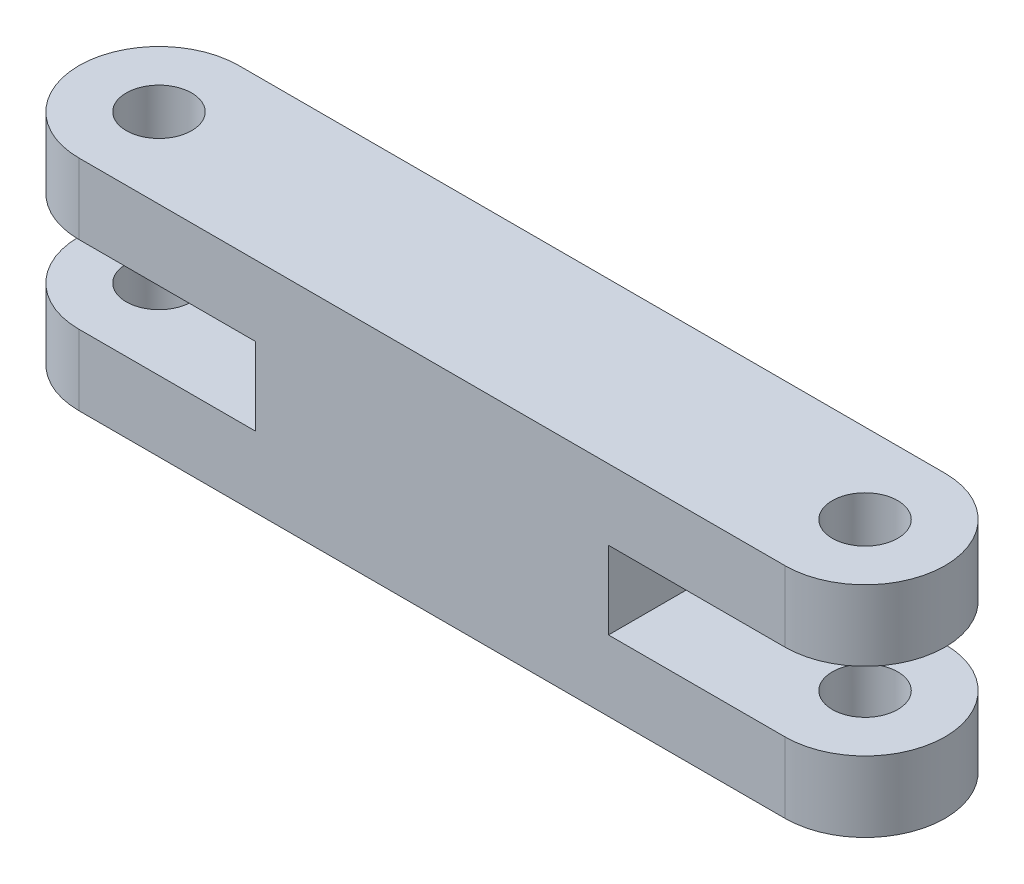
ISO-10303-21;
HEADER;
FILE_DESCRIPTION(('STEP AP214'),'2;1');
FILE_NAME('part.step','',(''),(''),'','','');
FILE_SCHEMA(('AUTOMOTIVE_DESIGN { 1 0 10303 214 1 1 1 1 }'));
ENDSEC;
DATA;
#1=APPLICATION_CONTEXT('core data for automotive mechanical design processes');
#2=APPLICATION_PROTOCOL_DEFINITION('international standard','automotive_design',2000,#1);
#3=PRODUCT_CONTEXT('',#1,'mechanical');
#4=PRODUCT('Part','Part','',(#3));
#5=PRODUCT_RELATED_PRODUCT_CATEGORY('part','',(#4));
#6=PRODUCT_DEFINITION_FORMATION('','',#4);
#7=PRODUCT_DEFINITION_CONTEXT('part definition',#1,'design');
#8=PRODUCT_DEFINITION('design','',#6,#7);
#9=PRODUCT_DEFINITION_SHAPE('','',#8);
#10=(LENGTH_UNIT() NAMED_UNIT(*) SI_UNIT(.MILLI.,.METRE.));
#11=(NAMED_UNIT(*) PLANE_ANGLE_UNIT() SI_UNIT($,.RADIAN.));
#12=(NAMED_UNIT(*) SI_UNIT($,.STERADIAN.) SOLID_ANGLE_UNIT());
#13=UNCERTAINTY_MEASURE_WITH_UNIT(LENGTH_MEASURE(1.E-05),#10,'distance_accuracy_value','');
#14=(GEOMETRIC_REPRESENTATION_CONTEXT(3) GLOBAL_UNCERTAINTY_ASSIGNED_CONTEXT((#13)) GLOBAL_UNIT_ASSIGNED_CONTEXT((#10,
#11,#12)) REPRESENTATION_CONTEXT('',''));
#15=CARTESIAN_POINT('',(0.,0.,0.));
#16=DIRECTION('',(0.,0.,1.));
#17=DIRECTION('',(1.,0.,0.));
#18=AXIS2_PLACEMENT_3D('',#15,#16,#17);
#19=CARTESIAN_POINT('',(0.,0.,-3.4));
#20=DIRECTION('',(0.,0.,-1.));
#21=DIRECTION('',(-1.,0.,0.));
#22=AXIS2_PLACEMENT_3D('',#19,#20,#21);
#23=PLANE('',#22);
#24=DIRECTION('',(-1.,0.,0.));
#25=VECTOR('',#24,1.);
#26=CARTESIAN_POINT('',(33.3999991416931,-3.,-3.4));
#27=LINE('',#26,#25);
#28=CARTESIAN_POINT('',(33.3999991416931,-3.,-3.4));
#29=VERTEX_POINT('',#28);
#30=CARTESIAN_POINT('',(25.8999991416931,-3.,-3.4));
#31=VERTEX_POINT('',#30);
#32=EDGE_CURVE('E149',#29,#31,#27,.T.);
#33=ORIENTED_EDGE('',*,*,#32,.T.);
#34=DIRECTION('',(0.,-1.,0.));
#35=VECTOR('',#34,1.);
#36=CARTESIAN_POINT('',(25.8999991416931,-3.,-3.4));
#37=LINE('',#36,#35);
#38=CARTESIAN_POINT('',(25.8999991416931,-6.30000003427267,-3.4));
#39=VERTEX_POINT('',#38);
#40=EDGE_CURVE('E178',#31,#39,#37,.T.);
#41=ORIENTED_EDGE('',*,*,#40,.T.);
#42=DIRECTION('',(-1.,0.,0.));
#43=VECTOR('',#42,1.);
#44=CARTESIAN_POINT('',(33.3999991416931,-6.30000003427267,-3.4));
#45=LINE('',#44,#43);
#46=CARTESIAN_POINT('',(33.3999991416931,-6.30000003427267,-3.4));
#47=VERTEX_POINT('',#46);
#48=EDGE_CURVE('E181',#47,#39,#45,.T.);
#49=ORIENTED_EDGE('',*,*,#48,.F.);
#50=DIRECTION('',(0.,1.,0.));
#51=VECTOR('',#50,1.);
#52=CARTESIAN_POINT('',(33.3999991416931,0.,-3.4));
#53=LINE('',#52,#51);
#54=CARTESIAN_POINT('',(33.3999991416931,-9.30000003427267,-3.4));
#55=VERTEX_POINT('',#54);
#56=EDGE_CURVE('E154',#55,#47,#53,.T.);
#57=ORIENTED_EDGE('',*,*,#56,.F.);
#58=DIRECTION('',(1.,0.,0.));
#59=VECTOR('',#58,1.);
#60=CARTESIAN_POINT('',(33.3999991416931,-9.30000003427267,-3.4));
#61=LINE('',#60,#59);
#62=CARTESIAN_POINT('',(3.40000004507601,-9.30000003427267,-3.4));
#63=VERTEX_POINT('',#62);
#64=EDGE_CURVE('E214',#63,#55,#61,.T.);
#65=ORIENTED_EDGE('',*,*,#64,.F.);
#66=DIRECTION('',(0.,-1.,0.));
#67=VECTOR('',#66,1.);
#68=CARTESIAN_POINT('',(3.40000004507601,-9.30000003427267,-3.4));
#69=LINE('',#68,#67);
#70=CARTESIAN_POINT('',(3.40000004507601,-6.30000003427267,-3.4));
#71=VERTEX_POINT('',#70);
#72=EDGE_CURVE('E42',#71,#63,#69,.T.);
#73=ORIENTED_EDGE('',*,*,#72,.F.);
#74=DIRECTION('',(1.,0.,0.));
#75=VECTOR('',#74,1.);
#76=CARTESIAN_POINT('',(3.40000004507601,-6.30000003427267,-3.4));
#77=LINE('',#76,#75);
#78=CARTESIAN_POINT('',(10.900000045076,-6.30000003427267,-3.4));
#79=VERTEX_POINT('',#78);
#80=EDGE_CURVE('E195',#71,#79,#77,.T.);
#81=ORIENTED_EDGE('',*,*,#80,.T.);
#82=DIRECTION('',(0.,-1.,0.));
#83=VECTOR('',#82,1.);
#84=CARTESIAN_POINT('',(10.900000045076,-3.,-3.4));
#85=LINE('',#84,#83);
#86=CARTESIAN_POINT('',(10.900000045076,-3.,-3.4));
#87=VERTEX_POINT('',#86);
#88=EDGE_CURVE('E192',#87,#79,#85,.T.);
#89=ORIENTED_EDGE('',*,*,#88,.F.);
#90=DIRECTION('',(1.,0.,0.));
#91=VECTOR('',#90,1.);
#92=CARTESIAN_POINT('',(3.40000004507601,-3.,-3.4));
#93=LINE('',#92,#91);
#94=CARTESIAN_POINT('',(3.40000004507601,-3.,-3.4));
#95=VERTEX_POINT('',#94);
#96=EDGE_CURVE('E190',#95,#87,#93,.T.);
#97=ORIENTED_EDGE('',*,*,#96,.F.);
#98=CARTESIAN_POINT('',(3.40000004507601,0.,-3.4));
#99=VERTEX_POINT('',#98);
#100=EDGE_CURVE('E11',#99,#95,#69,.T.);
#101=ORIENTED_EDGE('',*,*,#100,.F.);
#102=DIRECTION('',(-1.,0.,0.));
#103=VECTOR('',#102,1.);
#104=CARTESIAN_POINT('',(3.40000004507601,0.,-3.4));
#105=LINE('',#104,#103);
#106=CARTESIAN_POINT('',(33.3999991416931,0.,-3.4));
#107=VERTEX_POINT('',#106);
#108=EDGE_CURVE('E58',#107,#99,#105,.T.);
#109=ORIENTED_EDGE('',*,*,#108,.F.);
#110=EDGE_CURVE('E217',#29,#107,#53,.T.);
#111=ORIENTED_EDGE('',*,*,#110,.F.);
#112=EDGE_LOOP('',(#33,#41,#49,#57,#65,#73,#81,#89,#97,#101,#109,#111));
#113=FACE_BOUND('',#112,.T.);
#114=ADVANCED_FACE('F33',(#113),#23,.T.);
#115=CARTESIAN_POINT('',(0.,0.,3.4));
#116=DIRECTION('',(0.,0.,-1.));
#117=DIRECTION('',(-1.,0.,0.));
#118=AXIS2_PLACEMENT_3D('',#115,#116,#117);
#119=PLANE('',#118);
#120=DIRECTION('',(0.,-1.,0.));
#121=VECTOR('',#120,1.);
#122=CARTESIAN_POINT('',(25.8999991416931,-3.,3.4));
#123=LINE('',#122,#121);
#124=CARTESIAN_POINT('',(25.8999991416931,-3.,3.4));
#125=VERTEX_POINT('',#124);
#126=CARTESIAN_POINT('',(25.8999991416931,-6.30000003427267,3.4));
#127=VERTEX_POINT('',#126);
#128=EDGE_CURVE('E150',#125,#127,#123,.T.);
#129=ORIENTED_EDGE('',*,*,#128,.F.);
#130=DIRECTION('',(-1.,0.,0.));
#131=VECTOR('',#130,1.);
#132=CARTESIAN_POINT('',(33.3999991416931,-3.,3.4));
#133=LINE('',#132,#131);
#134=CARTESIAN_POINT('',(33.3999991416931,-3.,3.4));
#135=VERTEX_POINT('',#134);
#136=EDGE_CURVE('E174',#135,#125,#133,.T.);
#137=ORIENTED_EDGE('',*,*,#136,.F.);
#138=DIRECTION('',(0.,1.,0.));
#139=VECTOR('',#138,1.);
#140=CARTESIAN_POINT('',(33.3999991416931,0.,3.4));
#141=LINE('',#140,#139);
#142=CARTESIAN_POINT('',(33.3999991416931,0.,3.4));
#143=VERTEX_POINT('',#142);
#144=EDGE_CURVE('E140',#135,#143,#141,.T.);
#145=ORIENTED_EDGE('',*,*,#144,.T.);
#146=DIRECTION('',(-1.,0.,0.));
#147=VECTOR('',#146,1.);
#148=CARTESIAN_POINT('',(3.40000004507601,0.,3.4));
#149=LINE('',#148,#147);
#150=CARTESIAN_POINT('',(3.40000004507601,0.,3.4));
#151=VERTEX_POINT('',#150);
#152=EDGE_CURVE('E139',#143,#151,#149,.T.);
#153=ORIENTED_EDGE('',*,*,#152,.T.);
#154=DIRECTION('',(0.,-1.,0.));
#155=VECTOR('',#154,1.);
#156=CARTESIAN_POINT('',(3.40000004507601,-9.30000003427267,3.4));
#157=LINE('',#156,#155);
#158=CARTESIAN_POINT('',(3.40000004507601,-3.,3.4));
#159=VERTEX_POINT('',#158);
#160=EDGE_CURVE('E212',#151,#159,#157,.T.);
#161=ORIENTED_EDGE('',*,*,#160,.T.);
#162=DIRECTION('',(1.,0.,0.));
#163=VECTOR('',#162,1.);
#164=CARTESIAN_POINT('',(3.40000004507601,-3.,3.4));
#165=LINE('',#164,#163);
#166=CARTESIAN_POINT('',(10.900000045076,-3.,3.4));
#167=VERTEX_POINT('',#166);
#168=EDGE_CURVE('E188',#159,#167,#165,.T.);
#169=ORIENTED_EDGE('',*,*,#168,.T.);
#170=DIRECTION('',(0.,-1.,0.));
#171=VECTOR('',#170,1.);
#172=CARTESIAN_POINT('',(10.900000045076,-3.,3.4));
#173=LINE('',#172,#171);
#174=CARTESIAN_POINT('',(10.900000045076,-6.30000003427267,3.4));
#175=VERTEX_POINT('',#174);
#176=EDGE_CURVE('E201',#167,#175,#173,.T.);
#177=ORIENTED_EDGE('',*,*,#176,.T.);
#178=DIRECTION('',(1.,0.,0.));
#179=VECTOR('',#178,1.);
#180=CARTESIAN_POINT('',(3.40000004507601,-6.30000003427267,3.4));
#181=LINE('',#180,#179);
#182=CARTESIAN_POINT('',(3.40000004507601,-6.30000003427267,3.4));
#183=VERTEX_POINT('',#182);
#184=EDGE_CURVE('E193',#183,#175,#181,.T.);
#185=ORIENTED_EDGE('',*,*,#184,.F.);
#186=CARTESIAN_POINT('',(3.40000004507601,-9.30000003427267,3.4));
#187=VERTEX_POINT('',#186);
#188=EDGE_CURVE('E211',#183,#187,#157,.T.);
#189=ORIENTED_EDGE('',*,*,#188,.T.);
#190=DIRECTION('',(1.,0.,0.));
#191=VECTOR('',#190,1.);
#192=CARTESIAN_POINT('',(33.3999991416931,-9.30000003427267,3.4));
#193=LINE('',#192,#191);
#194=CARTESIAN_POINT('',(33.3999991416931,-9.30000003427267,3.4));
#195=VERTEX_POINT('',#194);
#196=EDGE_CURVE('E134',#187,#195,#193,.T.);
#197=ORIENTED_EDGE('',*,*,#196,.T.);
#198=CARTESIAN_POINT('',(33.3999991416931,-6.30000003427267,3.4));
#199=VERTEX_POINT('',#198);
#200=EDGE_CURVE('E127',#195,#199,#141,.T.);
#201=ORIENTED_EDGE('',*,*,#200,.T.);
#202=DIRECTION('',(-1.,0.,0.));
#203=VECTOR('',#202,1.);
#204=CARTESIAN_POINT('',(33.3999991416931,-6.30000003427267,3.4));
#205=LINE('',#204,#203);
#206=EDGE_CURVE('E131',#199,#127,#205,.T.);
#207=ORIENTED_EDGE('',*,*,#206,.T.);
#208=EDGE_LOOP('',(#129,#137,#145,#153,#161,#169,#177,#185,#189,#197,#201,#207));
#209=FACE_BOUND('',#208,.T.);
#210=ADVANCED_FACE('F130',(#209),#119,.F.);
#211=CARTESIAN_POINT('',(33.3999991416931,-9.30000003427267,-3.4));
#212=DIRECTION('',(0.,-1.,0.));
#213=DIRECTION('',(0.,0.,-1.));
#214=AXIS2_PLACEMENT_3D('',#211,#212,#213);
#215=PLANE('',#214);
#216=CARTESIAN_POINT('',(33.3999991416931,-9.30000003427267,0.));
#217=DIRECTION('',(0.,1.,0.));
#218=DIRECTION('',(0.,0.,1.));
#219=AXIS2_PLACEMENT_3D('',#216,#217,#218);
#220=CIRCLE('',#219,1.39);
#221=CARTESIAN_POINT('',(33.3999991416931,-9.30000003427267,1.39));
#222=VERTEX_POINT('',#221);
#223=EDGE_CURVE('E238',#222,#222,#220,.T.);
#224=ORIENTED_EDGE('',*,*,#223,.T.);
#225=EDGE_LOOP('',(#224));
#226=FACE_BOUND('',#225,.T.);
#227=CARTESIAN_POINT('',(3.40000004507601,-9.30000003427267,0.));
#228=DIRECTION('',(0.,1.,0.));
#229=DIRECTION('',(0.,0.,1.));
#230=AXIS2_PLACEMENT_3D('',#227,#228,#229);
#231=CIRCLE('',#230,1.39);
#232=CARTESIAN_POINT('',(3.40000004507601,-9.30000003427267,1.39));
#233=VERTEX_POINT('',#232);
#234=EDGE_CURVE('E221',#233,#233,#231,.T.);
#235=ORIENTED_EDGE('',*,*,#234,.T.);
#236=EDGE_LOOP('',(#235));
#237=FACE_BOUND('',#236,.T.);
#238=ORIENTED_EDGE('',*,*,#64,.T.);
#239=CARTESIAN_POINT('',(33.3999991416931,-9.30000003427267,0.));
#240=DIRECTION('',(0.,-1.,0.));
#241=DIRECTION('',(0.,0.,1.));
#242=AXIS2_PLACEMENT_3D('',#239,#240,#241);
#243=CIRCLE('',#242,3.4);
#244=EDGE_CURVE('E156',#55,#195,#243,.T.);
#245=ORIENTED_EDGE('',*,*,#244,.T.);
#246=ORIENTED_EDGE('',*,*,#196,.F.);
#247=CARTESIAN_POINT('',(3.40000004507601,-9.30000003427267,0.));
#248=DIRECTION('',(0.,-1.,0.));
#249=DIRECTION('',(0.,0.,-1.));
#250=AXIS2_PLACEMENT_3D('',#247,#248,#249);
#251=CIRCLE('',#250,3.4);
#252=EDGE_CURVE('E155',#187,#63,#251,.T.);
#253=ORIENTED_EDGE('',*,*,#252,.T.);
#254=EDGE_LOOP('',(#238,#245,#246,#253));
#255=FACE_BOUND('',#254,.T.);
#256=ADVANCED_FACE('F35',(#226,#237,#255),#215,.T.);
#257=CARTESIAN_POINT('',(3.40000004507601,0.,-3.4));
#258=DIRECTION('',(0.,1.,0.));
#259=DIRECTION('',(0.,0.,1.));
#260=AXIS2_PLACEMENT_3D('',#257,#258,#259);
#261=PLANE('',#260);
#262=CARTESIAN_POINT('',(33.3999991416931,0.,0.));
#263=DIRECTION('',(0.,1.,0.));
#264=DIRECTION('',(0.,0.,1.));
#265=AXIS2_PLACEMENT_3D('',#262,#263,#264);
#266=CIRCLE('',#265,1.39);
#267=CARTESIAN_POINT('',(33.3999991416931,0.,1.39));
#268=VERTEX_POINT('',#267);
#269=EDGE_CURVE('E235',#268,#268,#266,.T.);
#270=ORIENTED_EDGE('',*,*,#269,.F.);
#271=EDGE_LOOP('',(#270));
#272=FACE_BOUND('',#271,.T.);
#273=CARTESIAN_POINT('',(3.40000004507601,0.,0.));
#274=DIRECTION('',(0.,1.,0.));
#275=DIRECTION('',(0.,0.,1.));
#276=AXIS2_PLACEMENT_3D('',#273,#274,#275);
#277=CIRCLE('',#276,1.39);
#278=CARTESIAN_POINT('',(3.40000004507601,0.,1.39));
#279=VERTEX_POINT('',#278);
#280=EDGE_CURVE('E226',#279,#279,#277,.T.);
#281=ORIENTED_EDGE('',*,*,#280,.F.);
#282=EDGE_LOOP('',(#281));
#283=FACE_BOUND('',#282,.T.);
#284=ORIENTED_EDGE('',*,*,#108,.T.);
#285=CARTESIAN_POINT('',(3.40000004507601,0.,0.));
#286=DIRECTION('',(0.,1.,0.));
#287=DIRECTION('',(0.,0.,1.));
#288=AXIS2_PLACEMENT_3D('',#285,#286,#287);
#289=CIRCLE('',#288,3.4);
#290=EDGE_CURVE('E169',#99,#151,#289,.T.);
#291=ORIENTED_EDGE('',*,*,#290,.T.);
#292=ORIENTED_EDGE('',*,*,#152,.F.);
#293=CARTESIAN_POINT('',(33.3999991416931,0.,0.));
#294=DIRECTION('',(0.,1.,0.));
#295=DIRECTION('',(0.,0.,-1.));
#296=AXIS2_PLACEMENT_3D('',#293,#294,#295);
#297=CIRCLE('',#296,3.4);
#298=EDGE_CURVE('E165',#143,#107,#297,.T.);
#299=ORIENTED_EDGE('',*,*,#298,.T.);
#300=EDGE_LOOP('',(#284,#291,#292,#299));
#301=FACE_BOUND('',#300,.T.);
#302=ADVANCED_FACE('F271',(#272,#283,#301),#261,.T.);
#303=CARTESIAN_POINT('',(3.40000004507601,-3.,-3.4));
#304=DIRECTION('',(0.,-1.,0.));
#305=DIRECTION('',(0.,0.,-1.));
#306=AXIS2_PLACEMENT_3D('',#303,#304,#305);
#307=PLANE('',#306);
#308=CARTESIAN_POINT('',(3.40000004507601,-3.,0.));
#309=DIRECTION('',(0.,-1.,0.));
#310=DIRECTION('',(0.,0.,-1.));
#311=AXIS2_PLACEMENT_3D('',#308,#309,#310);
#312=CIRCLE('',#311,1.39);
#313=CARTESIAN_POINT('',(3.40000004507601,-3.,-1.39));
#314=VERTEX_POINT('',#313);
#315=EDGE_CURVE('E160',#314,#314,#312,.T.);
#316=ORIENTED_EDGE('',*,*,#315,.F.);
#317=EDGE_LOOP('',(#316));
#318=FACE_BOUND('',#317,.T.);
#319=ORIENTED_EDGE('',*,*,#168,.F.);
#320=CARTESIAN_POINT('',(3.40000004507601,-3.,0.));
#321=DIRECTION('',(0.,1.,0.));
#322=DIRECTION('',(0.,0.,1.));
#323=AXIS2_PLACEMENT_3D('',#320,#321,#322);
#324=CIRCLE('',#323,3.4);
#325=EDGE_CURVE('E171',#95,#159,#324,.T.);
#326=ORIENTED_EDGE('',*,*,#325,.F.);
#327=ORIENTED_EDGE('',*,*,#96,.T.);
#328=DIRECTION('',(0.,0.,1.));
#329=VECTOR('',#328,1.);
#330=CARTESIAN_POINT('',(10.900000045076,-3.,-3.4));
#331=LINE('',#330,#329);
#332=EDGE_CURVE('E206',#87,#167,#331,.T.);
#333=ORIENTED_EDGE('',*,*,#332,.T.);
#334=EDGE_LOOP('',(#319,#326,#327,#333));
#335=FACE_BOUND('',#334,.T.);
#336=ADVANCED_FACE('F273',(#318,#335),#307,.T.);
#337=CARTESIAN_POINT('',(10.900000045076,-3.,-3.4));
#338=DIRECTION('',(-1.,0.,0.));
#339=DIRECTION('',(0.,0.,1.));
#340=AXIS2_PLACEMENT_3D('',#337,#338,#339);
#341=PLANE('',#340);
#342=ORIENTED_EDGE('',*,*,#176,.F.);
#343=ORIENTED_EDGE('',*,*,#332,.F.);
#344=ORIENTED_EDGE('',*,*,#88,.T.);
#345=DIRECTION('',(0.,0.,1.));
#346=VECTOR('',#345,1.);
#347=CARTESIAN_POINT('',(10.900000045076,-6.30000003427267,-3.4));
#348=LINE('',#347,#346);
#349=EDGE_CURVE('E198',#79,#175,#348,.T.);
#350=ORIENTED_EDGE('',*,*,#349,.T.);
#351=EDGE_LOOP('',(#342,#343,#344,#350));
#352=FACE_BOUND('',#351,.T.);
#353=ADVANCED_FACE('F279',(#352),#341,.T.);
#354=CARTESIAN_POINT('',(3.40000004507601,-6.30000003427267,-3.4));
#355=DIRECTION('',(0.,-1.,0.));
#356=DIRECTION('',(0.,0.,-1.));
#357=AXIS2_PLACEMENT_3D('',#354,#355,#356);
#358=PLANE('',#357);
#359=CARTESIAN_POINT('',(3.40000004507601,-6.30000003427267,0.));
#360=DIRECTION('',(0.,-1.,0.));
#361=DIRECTION('',(0.,0.,-1.));
#362=AXIS2_PLACEMENT_3D('',#359,#360,#361);
#363=CIRCLE('',#362,1.39);
#364=CARTESIAN_POINT('',(3.40000004507601,-6.30000003427267,-1.39));
#365=VERTEX_POINT('',#364);
#366=EDGE_CURVE('E219',#365,#365,#363,.T.);
#367=ORIENTED_EDGE('',*,*,#366,.T.);
#368=EDGE_LOOP('',(#367));
#369=FACE_BOUND('',#368,.T.);
#370=ORIENTED_EDGE('',*,*,#184,.T.);
#371=ORIENTED_EDGE('',*,*,#349,.F.);
#372=ORIENTED_EDGE('',*,*,#80,.F.);
#373=CARTESIAN_POINT('',(3.40000004507601,-6.30000003427267,0.));
#374=DIRECTION('',(0.,-1.,0.));
#375=DIRECTION('',(0.,0.,-1.));
#376=AXIS2_PLACEMENT_3D('',#373,#374,#375);
#377=CIRCLE('',#376,3.4);
#378=EDGE_CURVE('E50',#183,#71,#377,.T.);
#379=ORIENTED_EDGE('',*,*,#378,.F.);
#380=EDGE_LOOP('',(#370,#371,#372,#379));
#381=FACE_BOUND('',#380,.T.);
#382=ADVANCED_FACE('F259',(#369,#381),#358,.F.);
#383=CARTESIAN_POINT('',(33.3999991416931,-3.,-3.4));
#384=DIRECTION('',(0.,1.,0.));
#385=DIRECTION('',(-1.,0.,0.));
#386=AXIS2_PLACEMENT_3D('',#383,#384,#385);
#387=PLANE('',#386);
#388=CARTESIAN_POINT('',(33.3999991416931,-3.,0.));
#389=DIRECTION('',(0.,1.,0.));
#390=DIRECTION('',(-1.,0.,0.));
#391=AXIS2_PLACEMENT_3D('',#388,#389,#390);
#392=CIRCLE('',#391,1.39);
#393=CARTESIAN_POINT('',(32.0099991416931,-3.,0.));
#394=VERTEX_POINT('',#393);
#395=EDGE_CURVE('E231',#394,#394,#392,.T.);
#396=ORIENTED_EDGE('',*,*,#395,.T.);
#397=EDGE_LOOP('',(#396));
#398=FACE_BOUND('',#397,.T.);
#399=ORIENTED_EDGE('',*,*,#136,.T.);
#400=DIRECTION('',(0.,0.,1.));
#401=VECTOR('',#400,1.);
#402=CARTESIAN_POINT('',(25.8999991416931,-3.,-3.4));
#403=LINE('',#402,#401);
#404=EDGE_CURVE('E183',#31,#125,#403,.T.);
#405=ORIENTED_EDGE('',*,*,#404,.F.);
#406=ORIENTED_EDGE('',*,*,#32,.F.);
#407=CARTESIAN_POINT('',(33.3999991416931,-3.,0.));
#408=DIRECTION('',(0.,1.,0.));
#409=DIRECTION('',(0.,0.,-1.));
#410=AXIS2_PLACEMENT_3D('',#407,#408,#409);
#411=CIRCLE('',#410,3.4);
#412=EDGE_CURVE('E167',#135,#29,#411,.T.);
#413=ORIENTED_EDGE('',*,*,#412,.F.);
#414=EDGE_LOOP('',(#399,#405,#406,#413));
#415=FACE_BOUND('',#414,.T.);
#416=ADVANCED_FACE('F250',(#398,#415),#387,.F.);
#417=CARTESIAN_POINT('',(33.3999991416931,-6.30000003427267,-3.4));
#418=DIRECTION('',(0.,1.,0.));
#419=DIRECTION('',(-1.,0.,0.));
#420=AXIS2_PLACEMENT_3D('',#417,#418,#419);
#421=PLANE('',#420);
#422=CARTESIAN_POINT('',(33.3999991416931,-6.30000003427267,0.));
#423=DIRECTION('',(0.,1.,0.));
#424=DIRECTION('',(-1.,0.,0.));
#425=AXIS2_PLACEMENT_3D('',#422,#423,#424);
#426=CIRCLE('',#425,1.39);
#427=CARTESIAN_POINT('',(32.0099991416931,-6.30000003427267,0.));
#428=VERTEX_POINT('',#427);
#429=EDGE_CURVE('E37',#428,#428,#426,.T.);
#430=ORIENTED_EDGE('',*,*,#429,.F.);
#431=EDGE_LOOP('',(#430));
#432=FACE_BOUND('',#431,.T.);
#433=ORIENTED_EDGE('',*,*,#206,.F.);
#434=CARTESIAN_POINT('',(33.3999991416931,-6.30000003427267,0.));
#435=DIRECTION('',(0.,-1.,0.));
#436=DIRECTION('',(0.,0.,1.));
#437=AXIS2_PLACEMENT_3D('',#434,#435,#436);
#438=CIRCLE('',#437,3.4);
#439=EDGE_CURVE('E145',#47,#199,#438,.T.);
#440=ORIENTED_EDGE('',*,*,#439,.F.);
#441=ORIENTED_EDGE('',*,*,#48,.T.);
#442=DIRECTION('',(0.,0.,1.));
#443=VECTOR('',#442,1.);
#444=CARTESIAN_POINT('',(25.8999991416931,-6.30000003427267,-3.4));
#445=LINE('',#444,#443);
#446=EDGE_CURVE('E147',#39,#127,#445,.T.);
#447=ORIENTED_EDGE('',*,*,#446,.T.);
#448=EDGE_LOOP('',(#433,#440,#441,#447));
#449=FACE_BOUND('',#448,.T.);
#450=ADVANCED_FACE('F144',(#432,#449),#421,.T.);
#451=CARTESIAN_POINT('',(25.8999991416931,-3.,-3.4));
#452=DIRECTION('',(-1.,0.,0.));
#453=DIRECTION('',(0.,0.,1.));
#454=AXIS2_PLACEMENT_3D('',#451,#452,#453);
#455=PLANE('',#454);
#456=ORIENTED_EDGE('',*,*,#128,.T.);
#457=ORIENTED_EDGE('',*,*,#446,.F.);
#458=ORIENTED_EDGE('',*,*,#40,.F.);
#459=ORIENTED_EDGE('',*,*,#404,.T.);
#460=EDGE_LOOP('',(#456,#457,#458,#459));
#461=FACE_BOUND('',#460,.T.);
#462=ADVANCED_FACE('F249',(#461),#455,.F.);
#463=CARTESIAN_POINT('',(3.40000004507601,-3.,0.));
#464=DIRECTION('',(0.,1.,0.));
#465=DIRECTION('',(0.,0.,1.));
#466=AXIS2_PLACEMENT_3D('',#463,#464,#465);
#467=CYLINDRICAL_SURFACE('',#466,3.4);
#468=ORIENTED_EDGE('',*,*,#290,.F.);
#469=ORIENTED_EDGE('',*,*,#100,.T.);
#470=ORIENTED_EDGE('',*,*,#325,.T.);
#471=ORIENTED_EDGE('',*,*,#160,.F.);
#472=EDGE_LOOP('',(#468,#469,#470,#471));
#473=FACE_BOUND('',#472,.T.);
#474=ADVANCED_FACE('F256',(#473),#467,.T.);
#475=CARTESIAN_POINT('',(33.3999991416931,-3.,0.));
#476=DIRECTION('',(0.,1.,0.));
#477=DIRECTION('',(0.,0.,1.));
#478=AXIS2_PLACEMENT_3D('',#475,#476,#477);
#479=CYLINDRICAL_SURFACE('',#478,3.4);
#480=ORIENTED_EDGE('',*,*,#298,.F.);
#481=ORIENTED_EDGE('',*,*,#144,.F.);
#482=ORIENTED_EDGE('',*,*,#412,.T.);
#483=ORIENTED_EDGE('',*,*,#110,.T.);
#484=EDGE_LOOP('',(#480,#481,#482,#483));
#485=FACE_BOUND('',#484,.T.);
#486=ADVANCED_FACE('F303',(#485),#479,.T.);
#487=CARTESIAN_POINT('',(3.40000004507601,-6.30000003427267,0.));
#488=DIRECTION('',(0.,-1.,0.));
#489=DIRECTION('',(0.,0.,-1.));
#490=AXIS2_PLACEMENT_3D('',#487,#488,#489);
#491=CYLINDRICAL_SURFACE('',#490,3.4);
#492=ORIENTED_EDGE('',*,*,#252,.F.);
#493=ORIENTED_EDGE('',*,*,#188,.F.);
#494=ORIENTED_EDGE('',*,*,#378,.T.);
#495=ORIENTED_EDGE('',*,*,#72,.T.);
#496=EDGE_LOOP('',(#492,#493,#494,#495));
#497=FACE_BOUND('',#496,.T.);
#498=ADVANCED_FACE('F300',(#497),#491,.T.);
#499=CARTESIAN_POINT('',(33.3999991416931,-6.30000003427267,0.));
#500=DIRECTION('',(0.,-1.,0.));
#501=DIRECTION('',(0.,0.,-1.));
#502=AXIS2_PLACEMENT_3D('',#499,#500,#501);
#503=CYLINDRICAL_SURFACE('',#502,3.4);
#504=ORIENTED_EDGE('',*,*,#244,.F.);
#505=ORIENTED_EDGE('',*,*,#56,.T.);
#506=ORIENTED_EDGE('',*,*,#439,.T.);
#507=ORIENTED_EDGE('',*,*,#200,.F.);
#508=EDGE_LOOP('',(#504,#505,#506,#507));
#509=FACE_BOUND('',#508,.T.);
#510=ADVANCED_FACE('F153',(#509),#503,.T.);
#511=CARTESIAN_POINT('',(3.40000004507601,-9.30000003427267,0.));
#512=DIRECTION('',(0.,1.,0.));
#513=DIRECTION('',(0.,0.,1.));
#514=AXIS2_PLACEMENT_3D('',#511,#512,#513);
#515=CYLINDRICAL_SURFACE('',#514,1.39);
#516=ORIENTED_EDGE('',*,*,#234,.F.);
#517=EDGE_LOOP('',(#516));
#518=FACE_BOUND('',#517,.T.);
#519=ORIENTED_EDGE('',*,*,#366,.F.);
#520=EDGE_LOOP('',(#519));
#521=FACE_BOUND('',#520,.T.);
#522=ADVANCED_FACE('F287',(#518,#521),#515,.F.);
#523=ORIENTED_EDGE('',*,*,#315,.T.);
#524=EDGE_LOOP('',(#523));
#525=FACE_BOUND('',#524,.T.);
#526=ORIENTED_EDGE('',*,*,#280,.T.);
#527=EDGE_LOOP('',(#526));
#528=FACE_BOUND('',#527,.T.);
#529=ADVANCED_FACE('F285',(#525,#528),#515,.F.);
#530=CARTESIAN_POINT('',(33.3999991416931,-9.30000003427267,0.));
#531=DIRECTION('',(0.,1.,0.));
#532=DIRECTION('',(0.,0.,1.));
#533=AXIS2_PLACEMENT_3D('',#530,#531,#532);
#534=CYLINDRICAL_SURFACE('',#533,1.39);
#535=ORIENTED_EDGE('',*,*,#429,.T.);
#536=EDGE_LOOP('',(#535));
#537=FACE_BOUND('',#536,.T.);
#538=ORIENTED_EDGE('',*,*,#223,.F.);
#539=EDGE_LOOP('',(#538));
#540=FACE_BOUND('',#539,.T.);
#541=ADVANCED_FACE('F245',(#537,#540),#534,.F.);
#542=ORIENTED_EDGE('',*,*,#269,.T.);
#543=EDGE_LOOP('',(#542));
#544=FACE_BOUND('',#543,.T.);
#545=ORIENTED_EDGE('',*,*,#395,.F.);
#546=EDGE_LOOP('',(#545));
#547=FACE_BOUND('',#546,.T.);
#548=ADVANCED_FACE('F294',(#544,#547),#534,.F.);
#549=CLOSED_SHELL('',(#114,#210,#256,#302,#336,#353,#382,#416,#450,#462,#474,#486,#498,#510,
#522,#529,#541,#548));
#550=MANIFOLD_SOLID_BREP('B2',#549);
#551=ADVANCED_BREP_SHAPE_REPRESENTATION('',(#18,#550),#14);
#552=SHAPE_DEFINITION_REPRESENTATION(#9,#551);
ENDSEC;
END-ISO-10303-21;
